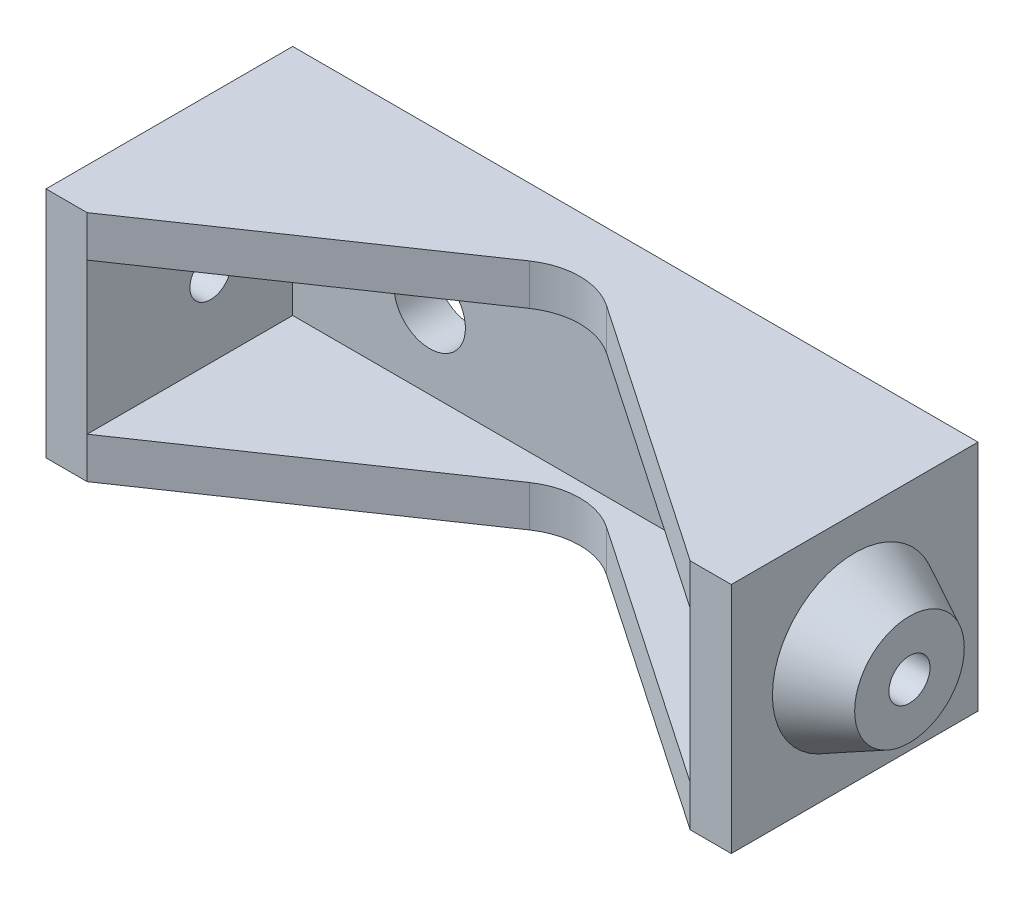
ISO-10303-21;
HEADER;
FILE_DESCRIPTION(('STEP AP214'),'2;1');
FILE_NAME('part.step','',(''),(''),'','','');
FILE_SCHEMA(('AUTOMOTIVE_DESIGN { 1 0 10303 214 1 1 1 1 }'));
ENDSEC;
DATA;
#1=APPLICATION_CONTEXT('core data for automotive mechanical design processes');
#2=APPLICATION_PROTOCOL_DEFINITION('international standard','automotive_design',2000,#1);
#3=PRODUCT_CONTEXT('',#1,'mechanical');
#4=PRODUCT('Part','Part','',(#3));
#5=PRODUCT_RELATED_PRODUCT_CATEGORY('part','',(#4));
#6=PRODUCT_DEFINITION_FORMATION('','',#4);
#7=PRODUCT_DEFINITION_CONTEXT('part definition',#1,'design');
#8=PRODUCT_DEFINITION('design','',#6,#7);
#9=PRODUCT_DEFINITION_SHAPE('','',#8);
#10=(LENGTH_UNIT() NAMED_UNIT(*) SI_UNIT(.MILLI.,.METRE.));
#11=(NAMED_UNIT(*) PLANE_ANGLE_UNIT() SI_UNIT($,.RADIAN.));
#12=(NAMED_UNIT(*) SI_UNIT($,.STERADIAN.) SOLID_ANGLE_UNIT());
#13=UNCERTAINTY_MEASURE_WITH_UNIT(LENGTH_MEASURE(1.E-05),#10,'distance_accuracy_value','');
#14=(GEOMETRIC_REPRESENTATION_CONTEXT(3) GLOBAL_UNCERTAINTY_ASSIGNED_CONTEXT((#13)) GLOBAL_UNIT_ASSIGNED_CONTEXT((#10,
#11,#12)) REPRESENTATION_CONTEXT('',''));
#15=CARTESIAN_POINT('',(0.,0.,0.));
#16=DIRECTION('',(0.,0.,1.));
#17=DIRECTION('',(1.,0.,0.));
#18=AXIS2_PLACEMENT_3D('',#15,#16,#17);
#19=CARTESIAN_POINT('',(0.,0.,18.));
#20=DIRECTION('',(0.,0.,-1.));
#21=DIRECTION('',(-1.,0.,0.));
#22=AXIS2_PLACEMENT_3D('',#19,#20,#21);
#23=PLANE('',#22);
#24=DIRECTION('',(-1.,0.,0.));
#25=VECTOR('',#24,1.);
#26=CARTESIAN_POINT('',(-25.,8.5,18.));
#27=LINE('',#26,#25);
#28=CARTESIAN_POINT('',(25.,8.5,18.));
#29=VERTEX_POINT('',#28);
#30=CARTESIAN_POINT('',(22.,8.50000000000001,18.));
#31=VERTEX_POINT('',#30);
#32=EDGE_CURVE('E89',#29,#31,#27,.T.);
#33=ORIENTED_EDGE('',*,*,#32,.T.);
#34=DIRECTION('',(0.,-1.,0.));
#35=VECTOR('',#34,1.);
#36=CARTESIAN_POINT('',(22.,78.2428311728166,18.));
#37=LINE('',#36,#35);
#38=CARTESIAN_POINT('',(22.,5.50000000000001,18.));
#39=VERTEX_POINT('',#38);
#40=EDGE_CURVE('E165',#31,#39,#37,.T.);
#41=ORIENTED_EDGE('',*,*,#40,.T.);
#42=DIRECTION('',(0.,1.,0.));
#43=VECTOR('',#42,1.);
#44=CARTESIAN_POINT('',(22.,-5.5,18.));
#45=LINE('',#44,#43);
#46=CARTESIAN_POINT('',(22.,-5.50000000000001,18.));
#47=VERTEX_POINT('',#46);
#48=EDGE_CURVE('E191',#47,#39,#45,.T.);
#49=ORIENTED_EDGE('',*,*,#48,.F.);
#50=CARTESIAN_POINT('',(22.,-8.49999999999999,18.));
#51=VERTEX_POINT('',#50);
#52=EDGE_CURVE('E181',#47,#51,#37,.T.);
#53=ORIENTED_EDGE('',*,*,#52,.T.);
#54=DIRECTION('',(1.,0.,0.));
#55=VECTOR('',#54,1.);
#56=CARTESIAN_POINT('',(-25.,-8.5,18.));
#57=LINE('',#56,#55);
#58=CARTESIAN_POINT('',(25.,-8.5,18.));
#59=VERTEX_POINT('',#58);
#60=EDGE_CURVE('E59',#51,#59,#57,.T.);
#61=ORIENTED_EDGE('',*,*,#60,.T.);
#62=DIRECTION('',(0.,1.,0.));
#63=VECTOR('',#62,1.);
#64=CARTESIAN_POINT('',(25.,-8.5,18.));
#65=LINE('',#64,#63);
#66=EDGE_CURVE('E222',#59,#29,#65,.T.);
#67=ORIENTED_EDGE('',*,*,#66,.T.);
#68=EDGE_LOOP('',(#33,#41,#49,#53,#61,#67));
#69=FACE_BOUND('',#68,.T.);
#70=ADVANCED_FACE('F34',(#69),#23,.F.);
#71=CARTESIAN_POINT('',(25.,-8.5,18.));
#72=DIRECTION('',(-1.,0.,0.));
#73=DIRECTION('',(0.,0.,1.));
#74=AXIS2_PLACEMENT_3D('',#71,#72,#73);
#75=PLANE('',#74);
#76=CARTESIAN_POINT('',(25.,0.,9.));
#77=DIRECTION('',(-1.,0.,0.));
#78=DIRECTION('',(0.,0.,1.));
#79=AXIS2_PLACEMENT_3D('',#76,#77,#78);
#80=CIRCLE('',#79,6.00000000000001);
#81=CARTESIAN_POINT('',(25.,0.,15.));
#82=VERTEX_POINT('',#81);
#83=EDGE_CURVE('E43',#82,#82,#80,.T.);
#84=ORIENTED_EDGE('',*,*,#83,.T.);
#85=EDGE_LOOP('',(#84));
#86=FACE_BOUND('',#85,.T.);
#87=DIRECTION('',(0.,1.,0.));
#88=VECTOR('',#87,1.);
#89=CARTESIAN_POINT('',(25.,-8.5,0.));
#90=LINE('',#89,#88);
#91=CARTESIAN_POINT('',(25.,-8.5,0.));
#92=VERTEX_POINT('',#91);
#93=CARTESIAN_POINT('',(25.,8.5,0.));
#94=VERTEX_POINT('',#93);
#95=EDGE_CURVE('E213',#92,#94,#90,.T.);
#96=ORIENTED_EDGE('',*,*,#95,.T.);
#97=DIRECTION('',(0.,0.,-1.));
#98=VECTOR('',#97,1.);
#99=CARTESIAN_POINT('',(25.,8.5,18.));
#100=LINE('',#99,#98);
#101=EDGE_CURVE('E245',#29,#94,#100,.T.);
#102=ORIENTED_EDGE('',*,*,#101,.F.);
#103=ORIENTED_EDGE('',*,*,#66,.F.);
#104=DIRECTION('',(0.,0.,-1.));
#105=VECTOR('',#104,1.);
#106=CARTESIAN_POINT('',(25.,-8.5,18.));
#107=LINE('',#106,#105);
#108=EDGE_CURVE('E231',#59,#92,#107,.T.);
#109=ORIENTED_EDGE('',*,*,#108,.T.);
#110=EDGE_LOOP('',(#96,#102,#103,#109));
#111=FACE_BOUND('',#110,.T.);
#112=ADVANCED_FACE('F256',(#86,#111),#75,.F.);
#113=CARTESIAN_POINT('',(-25.,8.5,18.));
#114=DIRECTION('',(0.,-1.,0.));
#115=DIRECTION('',(0.,0.,-1.));
#116=AXIS2_PLACEMENT_3D('',#113,#114,#115);
#117=PLANE('',#116);
#118=CARTESIAN_POINT('',(0.,8.50000000000001,9.05160316167925));
#119=DIRECTION('',(0.,-1.,0.));
#120=DIRECTION('',(0.,0.,-1.));
#121=AXIS2_PLACEMENT_3D('',#118,#119,#120);
#122=CIRCLE('',#121,5.);
#123=CARTESIAN_POINT('',(2.81668412320757,8.50000000000001,4.92046644764152));
#124=VERTEX_POINT('',#123);
#125=CARTESIAN_POINT('',(-2.81668412320757,8.50000000000001,4.92046644764153));
#126=VERTEX_POINT('',#125);
#127=EDGE_CURVE('E153',#124,#126,#122,.F.);
#128=ORIENTED_EDGE('',*,*,#127,.F.);
#129=DIRECTION('',(-0.826227342807548,0.,-0.56333682464151));
#130=VECTOR('',#129,1.);
#131=CARTESIAN_POINT('',(2.81668412320757,8.50000000000001,4.92046644764152));
#132=LINE('',#131,#130);
#133=EDGE_CURVE('E162',#31,#124,#132,.T.);
#134=ORIENTED_EDGE('',*,*,#133,.F.);
#135=ORIENTED_EDGE('',*,*,#32,.F.);
#136=ORIENTED_EDGE('',*,*,#101,.T.);
#137=DIRECTION('',(-1.,0.,0.));
#138=VECTOR('',#137,1.);
#139=CARTESIAN_POINT('',(-25.,8.5,0.));
#140=LINE('',#139,#138);
#141=CARTESIAN_POINT('',(-25.,8.5,0.));
#142=VERTEX_POINT('',#141);
#143=EDGE_CURVE('E234',#94,#142,#140,.T.);
#144=ORIENTED_EDGE('',*,*,#143,.T.);
#145=DIRECTION('',(0.,0.,-1.));
#146=VECTOR('',#145,1.);
#147=CARTESIAN_POINT('',(-25.,8.5,18.));
#148=LINE('',#147,#146);
#149=CARTESIAN_POINT('',(-25.,8.5,18.));
#150=VERTEX_POINT('',#149);
#151=EDGE_CURVE('E242',#150,#142,#148,.T.);
#152=ORIENTED_EDGE('',*,*,#151,.F.);
#153=CARTESIAN_POINT('',(-22.,8.50000000000001,18.));
#154=VERTEX_POINT('',#153);
#155=EDGE_CURVE('E224',#154,#150,#27,.T.);
#156=ORIENTED_EDGE('',*,*,#155,.F.);
#157=DIRECTION('',(-0.826227342807548,0.,0.56333682464151));
#158=VECTOR('',#157,1.);
#159=CARTESIAN_POINT('',(-2.81668412320757,8.50000000000001,4.92046644764153));
#160=LINE('',#159,#158);
#161=EDGE_CURVE('E170',#126,#154,#160,.T.);
#162=ORIENTED_EDGE('',*,*,#161,.F.);
#163=EDGE_LOOP('',(#128,#134,#135,#136,#144,#152,#156,#162));
#164=FACE_BOUND('',#163,.T.);
#165=ADVANCED_FACE('F168',(#164),#117,.F.);
#166=CARTESIAN_POINT('',(-25.,-8.5,18.));
#167=DIRECTION('',(1.,0.,0.));
#168=DIRECTION('',(0.,0.,-1.));
#169=AXIS2_PLACEMENT_3D('',#166,#167,#168);
#170=PLANE('',#169);
#171=CARTESIAN_POINT('',(-25.,0.,9.));
#172=DIRECTION('',(1.,0.,0.));
#173=DIRECTION('',(0.,0.,-1.));
#174=AXIS2_PLACEMENT_3D('',#171,#172,#173);
#175=CIRCLE('',#174,5.99999999999999);
#176=CARTESIAN_POINT('',(-25.,0.,3.));
#177=VERTEX_POINT('',#176);
#178=EDGE_CURVE('E11',#177,#177,#175,.T.);
#179=ORIENTED_EDGE('',*,*,#178,.T.);
#180=EDGE_LOOP('',(#179));
#181=FACE_BOUND('',#180,.T.);
#182=DIRECTION('',(0.,-1.,0.));
#183=VECTOR('',#182,1.);
#184=CARTESIAN_POINT('',(-25.,-8.5,0.));
#185=LINE('',#184,#183);
#186=CARTESIAN_POINT('',(-25.,-8.5,0.));
#187=VERTEX_POINT('',#186);
#188=EDGE_CURVE('E236',#142,#187,#185,.T.);
#189=ORIENTED_EDGE('',*,*,#188,.T.);
#190=DIRECTION('',(0.,0.,-1.));
#191=VECTOR('',#190,1.);
#192=CARTESIAN_POINT('',(-25.,-8.5,18.));
#193=LINE('',#192,#191);
#194=CARTESIAN_POINT('',(-25.,-8.5,18.));
#195=VERTEX_POINT('',#194);
#196=EDGE_CURVE('E240',#195,#187,#193,.T.);
#197=ORIENTED_EDGE('',*,*,#196,.F.);
#198=DIRECTION('',(0.,-1.,0.));
#199=VECTOR('',#198,1.);
#200=CARTESIAN_POINT('',(-25.,-8.5,18.));
#201=LINE('',#200,#199);
#202=EDGE_CURVE('E226',#150,#195,#201,.T.);
#203=ORIENTED_EDGE('',*,*,#202,.F.);
#204=ORIENTED_EDGE('',*,*,#151,.T.);
#205=EDGE_LOOP('',(#189,#197,#203,#204));
#206=FACE_BOUND('',#205,.T.);
#207=ADVANCED_FACE('F325',(#181,#206),#170,.F.);
#208=CARTESIAN_POINT('',(-25.,-8.5,18.));
#209=DIRECTION('',(0.,1.,0.));
#210=DIRECTION('',(0.,0.,1.));
#211=AXIS2_PLACEMENT_3D('',#208,#209,#210);
#212=PLANE('',#211);
#213=CARTESIAN_POINT('',(0.,-8.49999999999999,9.05160316167925));
#214=DIRECTION('',(0.,-1.,0.));
#215=DIRECTION('',(0.,0.,-1.));
#216=AXIS2_PLACEMENT_3D('',#213,#214,#215);
#217=CIRCLE('',#216,5.);
#218=CARTESIAN_POINT('',(2.81668412320757,-8.49999999999999,4.92046644764152));
#219=VERTEX_POINT('',#218);
#220=CARTESIAN_POINT('',(-2.81668412320757,-8.49999999999999,4.92046644764153));
#221=VERTEX_POINT('',#220);
#222=EDGE_CURVE('E294',#219,#221,#217,.F.);
#223=ORIENTED_EDGE('',*,*,#222,.T.);
#224=DIRECTION('',(-0.826227342807548,0.,0.56333682464151));
#225=VECTOR('',#224,1.);
#226=CARTESIAN_POINT('',(-2.81668412320757,-8.49999999999999,4.92046644764153));
#227=LINE('',#226,#225);
#228=CARTESIAN_POINT('',(-22.,-8.49999999999999,18.));
#229=VERTEX_POINT('',#228);
#230=EDGE_CURVE('E172',#221,#229,#227,.T.);
#231=ORIENTED_EDGE('',*,*,#230,.T.);
#232=EDGE_CURVE('E228',#195,#229,#57,.T.);
#233=ORIENTED_EDGE('',*,*,#232,.F.);
#234=ORIENTED_EDGE('',*,*,#196,.T.);
#235=DIRECTION('',(1.,0.,0.));
#236=VECTOR('',#235,1.);
#237=CARTESIAN_POINT('',(-25.,-8.5,0.));
#238=LINE('',#237,#236);
#239=EDGE_CURVE('E81',#187,#92,#238,.T.);
#240=ORIENTED_EDGE('',*,*,#239,.T.);
#241=ORIENTED_EDGE('',*,*,#108,.F.);
#242=ORIENTED_EDGE('',*,*,#60,.F.);
#243=DIRECTION('',(-0.826227342807548,0.,-0.56333682464151));
#244=VECTOR('',#243,1.);
#245=CARTESIAN_POINT('',(2.81668412320757,-8.49999999999999,4.92046644764152));
#246=LINE('',#245,#244);
#247=EDGE_CURVE('E291',#51,#219,#246,.T.);
#248=ORIENTED_EDGE('',*,*,#247,.T.);
#249=EDGE_LOOP('',(#223,#231,#233,#234,#240,#241,#242,#248));
#250=FACE_BOUND('',#249,.T.);
#251=ADVANCED_FACE('F298',(#250),#212,.F.);
#252=ORIENTED_EDGE('',*,*,#232,.T.);
#253=DIRECTION('',(0.,-1.,0.));
#254=VECTOR('',#253,1.);
#255=CARTESIAN_POINT('',(-22.,78.2428311728166,18.));
#256=LINE('',#255,#254);
#257=CARTESIAN_POINT('',(-22.,-5.50000000000001,18.));
#258=VERTEX_POINT('',#257);
#259=EDGE_CURVE('E178',#258,#229,#256,.T.);
#260=ORIENTED_EDGE('',*,*,#259,.F.);
#261=DIRECTION('',(0.,-1.,0.));
#262=VECTOR('',#261,1.);
#263=CARTESIAN_POINT('',(-22.,-5.5,18.));
#264=LINE('',#263,#262);
#265=CARTESIAN_POINT('',(-22.,5.5,18.));
#266=VERTEX_POINT('',#265);
#267=EDGE_CURVE('E196',#266,#258,#264,.T.);
#268=ORIENTED_EDGE('',*,*,#267,.F.);
#269=EDGE_CURVE('E176',#154,#266,#256,.T.);
#270=ORIENTED_EDGE('',*,*,#269,.F.);
#271=ORIENTED_EDGE('',*,*,#155,.T.);
#272=ORIENTED_EDGE('',*,*,#202,.T.);
#273=EDGE_LOOP('',(#252,#260,#268,#270,#271,#272));
#274=FACE_BOUND('',#273,.T.);
#275=ADVANCED_FACE('F307',(#274),#23,.F.);
#276=CARTESIAN_POINT('',(0.,0.,0.));
#277=DIRECTION('',(0.,0.,-1.));
#278=DIRECTION('',(-1.,0.,0.));
#279=AXIS2_PLACEMENT_3D('',#276,#277,#278);
#280=PLANE('',#279);
#281=CARTESIAN_POINT('',(12.,0.,0.));
#282=DIRECTION('',(0.,0.,1.));
#283=DIRECTION('',(-1.,0.,0.));
#284=AXIS2_PLACEMENT_3D('',#281,#282,#283);
#285=CIRCLE('',#284,2.6);
#286=CARTESIAN_POINT('',(9.39999999999999,0.,0.));
#287=VERTEX_POINT('',#286);
#288=EDGE_CURVE('E281',#287,#287,#285,.T.);
#289=ORIENTED_EDGE('',*,*,#288,.T.);
#290=EDGE_LOOP('',(#289));
#291=FACE_BOUND('',#290,.T.);
#292=CARTESIAN_POINT('',(-12.,0.,0.));
#293=DIRECTION('',(0.,0.,1.));
#294=DIRECTION('',(1.,0.,0.));
#295=AXIS2_PLACEMENT_3D('',#292,#293,#294);
#296=CIRCLE('',#295,2.6);
#297=CARTESIAN_POINT('',(-9.39999999999999,0.,0.));
#298=VERTEX_POINT('',#297);
#299=EDGE_CURVE('E166',#298,#298,#296,.T.);
#300=ORIENTED_EDGE('',*,*,#299,.T.);
#301=EDGE_LOOP('',(#300));
#302=FACE_BOUND('',#301,.T.);
#303=ORIENTED_EDGE('',*,*,#95,.F.);
#304=ORIENTED_EDGE('',*,*,#239,.F.);
#305=ORIENTED_EDGE('',*,*,#188,.F.);
#306=ORIENTED_EDGE('',*,*,#143,.F.);
#307=EDGE_LOOP('',(#303,#304,#305,#306));
#308=FACE_BOUND('',#307,.T.);
#309=ADVANCED_FACE('F328',(#291,#302,#308),#280,.T.);
#310=CARTESIAN_POINT('',(22.,-5.5,3.));
#311=DIRECTION('',(1.,0.,0.));
#312=DIRECTION('',(0.,0.,-1.));
#313=AXIS2_PLACEMENT_3D('',#310,#311,#312);
#314=PLANE('',#313);
#315=CARTESIAN_POINT('',(22.,0.,9.));
#316=DIRECTION('',(1.,0.,0.));
#317=DIRECTION('',(0.,0.,-1.));
#318=AXIS2_PLACEMENT_3D('',#315,#316,#317);
#319=CIRCLE('',#318,1.5);
#320=CARTESIAN_POINT('',(22.,0.,7.5));
#321=VERTEX_POINT('',#320);
#322=EDGE_CURVE('E274',#321,#321,#319,.T.);
#323=ORIENTED_EDGE('',*,*,#322,.T.);
#324=EDGE_LOOP('',(#323));
#325=FACE_BOUND('',#324,.T.);
#326=ORIENTED_EDGE('',*,*,#48,.T.);
#327=DIRECTION('',(0.,0.,1.));
#328=VECTOR('',#327,1.);
#329=CARTESIAN_POINT('',(22.,5.5,3.));
#330=LINE('',#329,#328);
#331=CARTESIAN_POINT('',(22.,5.5,3.));
#332=VERTEX_POINT('',#331);
#333=EDGE_CURVE('E205',#332,#39,#330,.T.);
#334=ORIENTED_EDGE('',*,*,#333,.F.);
#335=DIRECTION('',(0.,1.,0.));
#336=VECTOR('',#335,1.);
#337=CARTESIAN_POINT('',(22.,-5.5,3.));
#338=LINE('',#337,#336);
#339=CARTESIAN_POINT('',(22.,-5.5,3.));
#340=VERTEX_POINT('',#339);
#341=EDGE_CURVE('E192',#340,#332,#338,.T.);
#342=ORIENTED_EDGE('',*,*,#341,.F.);
#343=DIRECTION('',(0.,0.,1.));
#344=VECTOR('',#343,1.);
#345=CARTESIAN_POINT('',(22.,-5.5,3.));
#346=LINE('',#345,#344);
#347=EDGE_CURVE('E210',#340,#47,#346,.T.);
#348=ORIENTED_EDGE('',*,*,#347,.T.);
#349=EDGE_LOOP('',(#326,#334,#342,#348));
#350=FACE_BOUND('',#349,.T.);
#351=ADVANCED_FACE('F333',(#325,#350),#314,.F.);
#352=CARTESIAN_POINT('',(-22.,-5.5,3.));
#353=DIRECTION('',(0.,-1.,0.));
#354=DIRECTION('',(0.,0.,-1.));
#355=AXIS2_PLACEMENT_3D('',#352,#353,#354);
#356=PLANE('',#355);
#357=CARTESIAN_POINT('',(0.,-5.50000000000001,9.05160316167925));
#358=DIRECTION('',(0.,-1.,0.));
#359=DIRECTION('',(0.,0.,-1.));
#360=AXIS2_PLACEMENT_3D('',#357,#358,#359);
#361=CIRCLE('',#360,5.);
#362=CARTESIAN_POINT('',(-2.81668412320757,-5.5,4.92046644764153));
#363=VERTEX_POINT('',#362);
#364=CARTESIAN_POINT('',(2.81668412320757,-5.50000000000001,4.92046644764152));
#365=VERTEX_POINT('',#364);
#366=EDGE_CURVE('E185',#363,#365,#361,.T.);
#367=ORIENTED_EDGE('',*,*,#366,.T.);
#368=DIRECTION('',(0.826227342807548,0.,0.56333682464151));
#369=VECTOR('',#368,1.);
#370=CARTESIAN_POINT('',(-15.0183356840621,-5.5,-7.23977433004231));
#371=LINE('',#370,#369);
#372=EDGE_CURVE('E188',#365,#47,#371,.T.);
#373=ORIENTED_EDGE('',*,*,#372,.T.);
#374=ORIENTED_EDGE('',*,*,#347,.F.);
#375=DIRECTION('',(1.,0.,0.));
#376=VECTOR('',#375,1.);
#377=CARTESIAN_POINT('',(-22.,-5.5,3.));
#378=LINE('',#377,#376);
#379=CARTESIAN_POINT('',(-22.,-5.5,3.));
#380=VERTEX_POINT('',#379);
#381=EDGE_CURVE('E202',#380,#340,#378,.T.);
#382=ORIENTED_EDGE('',*,*,#381,.F.);
#383=DIRECTION('',(0.,0.,1.));
#384=VECTOR('',#383,1.);
#385=CARTESIAN_POINT('',(-22.,-5.5,3.));
#386=LINE('',#385,#384);
#387=EDGE_CURVE('E214',#380,#258,#386,.T.);
#388=ORIENTED_EDGE('',*,*,#387,.T.);
#389=DIRECTION('',(0.826227342807548,0.,-0.56333682464151));
#390=VECTOR('',#389,1.);
#391=CARTESIAN_POINT('',(-15.0183356840621,-5.5,13.2397743300423));
#392=LINE('',#391,#390);
#393=EDGE_CURVE('E159',#258,#363,#392,.T.);
#394=ORIENTED_EDGE('',*,*,#393,.T.);
#395=EDGE_LOOP('',(#367,#373,#374,#382,#388,#394));
#396=FACE_BOUND('',#395,.T.);
#397=ADVANCED_FACE('F311',(#396),#356,.F.);
#398=CARTESIAN_POINT('',(-22.,-5.5,3.));
#399=DIRECTION('',(-1.,0.,0.));
#400=DIRECTION('',(0.,0.,1.));
#401=AXIS2_PLACEMENT_3D('',#398,#399,#400);
#402=PLANE('',#401);
#403=CARTESIAN_POINT('',(-22.,0.,9.));
#404=DIRECTION('',(-1.,0.,0.));
#405=DIRECTION('',(0.,0.,1.));
#406=AXIS2_PLACEMENT_3D('',#403,#404,#405);
#407=CIRCLE('',#406,1.5);
#408=CARTESIAN_POINT('',(-22.,0.,10.5));
#409=VERTEX_POINT('',#408);
#410=EDGE_CURVE('E38',#409,#409,#407,.T.);
#411=ORIENTED_EDGE('',*,*,#410,.T.);
#412=EDGE_LOOP('',(#411));
#413=FACE_BOUND('',#412,.T.);
#414=ORIENTED_EDGE('',*,*,#267,.T.);
#415=ORIENTED_EDGE('',*,*,#387,.F.);
#416=DIRECTION('',(0.,-1.,0.));
#417=VECTOR('',#416,1.);
#418=CARTESIAN_POINT('',(-22.,-5.5,3.));
#419=LINE('',#418,#417);
#420=CARTESIAN_POINT('',(-22.,5.5,3.));
#421=VERTEX_POINT('',#420);
#422=EDGE_CURVE('E199',#421,#380,#419,.T.);
#423=ORIENTED_EDGE('',*,*,#422,.F.);
#424=DIRECTION('',(0.,0.,1.));
#425=VECTOR('',#424,1.);
#426=CARTESIAN_POINT('',(-22.,5.5,3.));
#427=LINE('',#426,#425);
#428=EDGE_CURVE('E217',#421,#266,#427,.T.);
#429=ORIENTED_EDGE('',*,*,#428,.T.);
#430=EDGE_LOOP('',(#414,#415,#423,#429));
#431=FACE_BOUND('',#430,.T.);
#432=ADVANCED_FACE('F314',(#413,#431),#402,.F.);
#433=CARTESIAN_POINT('',(-22.,5.5,3.));
#434=DIRECTION('',(0.,1.,0.));
#435=DIRECTION('',(0.,0.,1.));
#436=AXIS2_PLACEMENT_3D('',#433,#434,#435);
#437=PLANE('',#436);
#438=ORIENTED_EDGE('',*,*,#333,.T.);
#439=DIRECTION('',(-0.826227342807548,0.,-0.56333682464151));
#440=VECTOR('',#439,1.);
#441=CARTESIAN_POINT('',(-15.0183356840621,5.5,-7.23977433004231));
#442=LINE('',#441,#440);
#443=CARTESIAN_POINT('',(2.81668412320757,5.50000000000001,4.92046644764152));
#444=VERTEX_POINT('',#443);
#445=EDGE_CURVE('E251',#39,#444,#442,.T.);
#446=ORIENTED_EDGE('',*,*,#445,.T.);
#447=CARTESIAN_POINT('',(0.,5.50000000000001,9.05160316167925));
#448=DIRECTION('',(0.,1.,0.));
#449=DIRECTION('',(0.,0.,1.));
#450=AXIS2_PLACEMENT_3D('',#447,#448,#449);
#451=CIRCLE('',#450,5.);
#452=CARTESIAN_POINT('',(-2.81668412320757,5.50000000000001,4.92046644764153));
#453=VERTEX_POINT('',#452);
#454=EDGE_CURVE('E156',#444,#453,#451,.T.);
#455=ORIENTED_EDGE('',*,*,#454,.T.);
#456=DIRECTION('',(-0.826227342807548,0.,0.56333682464151));
#457=VECTOR('',#456,1.);
#458=CARTESIAN_POINT('',(-15.0183356840621,5.5,13.2397743300423));
#459=LINE('',#458,#457);
#460=EDGE_CURVE('E247',#453,#266,#459,.T.);
#461=ORIENTED_EDGE('',*,*,#460,.T.);
#462=ORIENTED_EDGE('',*,*,#428,.F.);
#463=DIRECTION('',(-1.,0.,0.));
#464=VECTOR('',#463,1.);
#465=CARTESIAN_POINT('',(-22.,5.5,3.));
#466=LINE('',#465,#464);
#467=EDGE_CURVE('E195',#332,#421,#466,.T.);
#468=ORIENTED_EDGE('',*,*,#467,.F.);
#469=EDGE_LOOP('',(#438,#446,#455,#461,#462,#468));
#470=FACE_BOUND('',#469,.T.);
#471=ADVANCED_FACE('F317',(#470),#437,.F.);
#472=CARTESIAN_POINT('',(0.,0.,3.));
#473=DIRECTION('',(0.,0.,-1.));
#474=DIRECTION('',(-1.,0.,0.));
#475=AXIS2_PLACEMENT_3D('',#472,#473,#474);
#476=PLANE('',#475);
#477=CARTESIAN_POINT('',(12.,0.,3.));
#478=DIRECTION('',(0.,0.,1.));
#479=DIRECTION('',(-1.,0.,0.));
#480=AXIS2_PLACEMENT_3D('',#477,#478,#479);
#481=CIRCLE('',#480,2.6);
#482=CARTESIAN_POINT('',(9.39999999999999,0.,3.));
#483=VERTEX_POINT('',#482);
#484=EDGE_CURVE('E280',#483,#483,#481,.T.);
#485=ORIENTED_EDGE('',*,*,#484,.F.);
#486=EDGE_LOOP('',(#485));
#487=FACE_BOUND('',#486,.T.);
#488=CARTESIAN_POINT('',(-12.,0.,3.));
#489=DIRECTION('',(0.,0.,1.));
#490=DIRECTION('',(1.,0.,0.));
#491=AXIS2_PLACEMENT_3D('',#488,#489,#490);
#492=CIRCLE('',#491,2.6);
#493=CARTESIAN_POINT('',(-9.39999999999999,0.,3.));
#494=VERTEX_POINT('',#493);
#495=EDGE_CURVE('E284',#494,#494,#492,.T.);
#496=ORIENTED_EDGE('',*,*,#495,.F.);
#497=EDGE_LOOP('',(#496));
#498=FACE_BOUND('',#497,.T.);
#499=ORIENTED_EDGE('',*,*,#341,.T.);
#500=ORIENTED_EDGE('',*,*,#467,.T.);
#501=ORIENTED_EDGE('',*,*,#422,.T.);
#502=ORIENTED_EDGE('',*,*,#381,.T.);
#503=EDGE_LOOP('',(#499,#500,#501,#502));
#504=FACE_BOUND('',#503,.T.);
#505=ADVANCED_FACE('F481',(#487,#498,#504),#476,.F.);
#506=CARTESIAN_POINT('',(-2.81668412320757,78.2428311728166,4.92046644764153));
#507=DIRECTION('',(-0.56333682464151,0.,-0.826227342807548));
#508=DIRECTION('',(-0.826227342807548,0.,0.56333682464151));
#509=AXIS2_PLACEMENT_3D('',#506,#507,#508);
#510=PLANE('',#509);
#511=ORIENTED_EDGE('',*,*,#460,.F.);
#512=DIRECTION('',(0.,-1.,0.));
#513=VECTOR('',#512,1.);
#514=CARTESIAN_POINT('',(-2.81668412320757,78.2428311728166,4.92046644764153));
#515=LINE('',#514,#513);
#516=EDGE_CURVE('E179',#126,#453,#515,.T.);
#517=ORIENTED_EDGE('',*,*,#516,.F.);
#518=ORIENTED_EDGE('',*,*,#161,.T.);
#519=ORIENTED_EDGE('',*,*,#269,.T.);
#520=EDGE_LOOP('',(#511,#517,#518,#519));
#521=FACE_BOUND('',#520,.T.);
#522=ADVANCED_FACE('F319',(#521),#510,.F.);
#523=CARTESIAN_POINT('',(0.,78.2428311728166,9.05160316167925));
#524=DIRECTION('',(0.,-1.,0.));
#525=DIRECTION('',(0.,0.,-1.));
#526=AXIS2_PLACEMENT_3D('',#523,#524,#525);
#527=CYLINDRICAL_SURFACE('',#526,5.);
#528=ORIENTED_EDGE('',*,*,#454,.F.);
#529=DIRECTION('',(0.,-1.,0.));
#530=VECTOR('',#529,1.);
#531=CARTESIAN_POINT('',(2.81668412320757,78.2428311728166,4.92046644764152));
#532=LINE('',#531,#530);
#533=EDGE_CURVE('E148',#124,#444,#532,.T.);
#534=ORIENTED_EDGE('',*,*,#533,.F.);
#535=ORIENTED_EDGE('',*,*,#127,.T.);
#536=ORIENTED_EDGE('',*,*,#516,.T.);
#537=EDGE_LOOP('',(#528,#534,#535,#536));
#538=FACE_BOUND('',#537,.T.);
#539=ADVANCED_FACE('F150',(#538),#527,.F.);
#540=CARTESIAN_POINT('',(2.81668412320757,78.2428311728166,4.92046644764152));
#541=DIRECTION('',(0.56333682464151,0.,-0.826227342807548));
#542=DIRECTION('',(-0.826227342807548,0.,-0.56333682464151));
#543=AXIS2_PLACEMENT_3D('',#540,#541,#542);
#544=PLANE('',#543);
#545=ORIENTED_EDGE('',*,*,#445,.F.);
#546=ORIENTED_EDGE('',*,*,#40,.F.);
#547=ORIENTED_EDGE('',*,*,#133,.T.);
#548=ORIENTED_EDGE('',*,*,#533,.T.);
#549=EDGE_LOOP('',(#545,#546,#547,#548));
#550=FACE_BOUND('',#549,.T.);
#551=ADVANCED_FACE('F163',(#550),#544,.F.);
#552=ORIENTED_EDGE('',*,*,#372,.F.);
#553=EDGE_CURVE('E160',#365,#219,#532,.T.);
#554=ORIENTED_EDGE('',*,*,#553,.T.);
#555=ORIENTED_EDGE('',*,*,#247,.F.);
#556=ORIENTED_EDGE('',*,*,#52,.F.);
#557=EDGE_LOOP('',(#552,#554,#555,#556));
#558=FACE_BOUND('',#557,.T.);
#559=ADVANCED_FACE('F336',(#558),#544,.F.);
#560=ORIENTED_EDGE('',*,*,#366,.F.);
#561=EDGE_CURVE('E50',#363,#221,#515,.T.);
#562=ORIENTED_EDGE('',*,*,#561,.T.);
#563=ORIENTED_EDGE('',*,*,#222,.F.);
#564=ORIENTED_EDGE('',*,*,#553,.F.);
#565=EDGE_LOOP('',(#560,#562,#563,#564));
#566=FACE_BOUND('',#565,.T.);
#567=ADVANCED_FACE('F302',(#566),#527,.F.);
#568=ORIENTED_EDGE('',*,*,#393,.F.);
#569=ORIENTED_EDGE('',*,*,#259,.T.);
#570=ORIENTED_EDGE('',*,*,#230,.F.);
#571=ORIENTED_EDGE('',*,*,#561,.F.);
#572=EDGE_LOOP('',(#568,#569,#570,#571));
#573=FACE_BOUND('',#572,.T.);
#574=ADVANCED_FACE('F303',(#573),#510,.F.);
#575=CARTESIAN_POINT('',(-12.,0.,0.));
#576=DIRECTION('',(0.,0.,1.));
#577=DIRECTION('',(1.,0.,0.));
#578=AXIS2_PLACEMENT_3D('',#575,#576,#577);
#579=CYLINDRICAL_SURFACE('',#578,2.6);
#580=ORIENTED_EDGE('',*,*,#299,.F.);
#581=EDGE_LOOP('',(#580));
#582=FACE_BOUND('',#581,.T.);
#583=ORIENTED_EDGE('',*,*,#495,.T.);
#584=EDGE_LOOP('',(#583));
#585=FACE_BOUND('',#584,.T.);
#586=ADVANCED_FACE('F464',(#582,#585),#579,.F.);
#587=CARTESIAN_POINT('',(12.,0.,0.));
#588=DIRECTION('',(0.,0.,1.));
#589=DIRECTION('',(1.,0.,0.));
#590=AXIS2_PLACEMENT_3D('',#587,#588,#589);
#591=CYLINDRICAL_SURFACE('',#590,2.6);
#592=ORIENTED_EDGE('',*,*,#288,.F.);
#593=EDGE_LOOP('',(#592));
#594=FACE_BOUND('',#593,.T.);
#595=ORIENTED_EDGE('',*,*,#484,.T.);
#596=EDGE_LOOP('',(#595));
#597=FACE_BOUND('',#596,.T.);
#598=ADVANCED_FACE('F454',(#594,#597),#591,.F.);
#599=CARTESIAN_POINT('',(-29.,0.,9.));
#600=DIRECTION('',(-1.,0.,0.));
#601=DIRECTION('',(0.,0.,1.));
#602=AXIS2_PLACEMENT_3D('',#599,#600,#601);
#603=PLANE('',#602);
#604=CARTESIAN_POINT('',(-29.,0.,9.));
#605=DIRECTION('',(-1.,0.,0.));
#606=DIRECTION('',(0.,0.,1.));
#607=AXIS2_PLACEMENT_3D('',#604,#605,#606);
#608=CIRCLE('',#607,4.);
#609=CARTESIAN_POINT('',(-29.,0.,13.));
#610=VERTEX_POINT('',#609);
#611=EDGE_CURVE('E271',#610,#610,#608,.T.);
#612=ORIENTED_EDGE('',*,*,#611,.T.);
#613=EDGE_LOOP('',(#612));
#614=FACE_BOUND('',#613,.T.);
#615=CARTESIAN_POINT('',(-29.,0.,9.));
#616=DIRECTION('',(-1.,0.,0.));
#617=DIRECTION('',(0.,0.,1.));
#618=AXIS2_PLACEMENT_3D('',#615,#616,#617);
#619=CIRCLE('',#618,1.5);
#620=CARTESIAN_POINT('',(-29.,0.,10.5));
#621=VERTEX_POINT('',#620);
#622=EDGE_CURVE('E267',#621,#621,#619,.T.);
#623=ORIENTED_EDGE('',*,*,#622,.F.);
#624=EDGE_LOOP('',(#623));
#625=FACE_BOUND('',#624,.T.);
#626=ADVANCED_FACE('F428',(#614,#625),#603,.T.);
#627=CARTESIAN_POINT('',(-29.,0.,9.));
#628=DIRECTION('',(1.,0.,0.));
#629=DIRECTION('',(0.,0.,-1.));
#630=AXIS2_PLACEMENT_3D('',#627,#628,#629);
#631=CYLINDRICAL_SURFACE('',#630,1.5);
#632=ORIENTED_EDGE('',*,*,#622,.T.);
#633=EDGE_LOOP('',(#632));
#634=FACE_BOUND('',#633,.T.);
#635=ORIENTED_EDGE('',*,*,#410,.F.);
#636=EDGE_LOOP('',(#635));
#637=FACE_BOUND('',#636,.T.);
#638=ADVANCED_FACE('F423',(#634,#637),#631,.F.);
#639=CARTESIAN_POINT('',(29.,0.,9.));
#640=DIRECTION('',(1.,0.,0.));
#641=DIRECTION('',(0.,0.,-1.));
#642=AXIS2_PLACEMENT_3D('',#639,#640,#641);
#643=PLANE('',#642);
#644=CARTESIAN_POINT('',(29.,0.,9.));
#645=DIRECTION('',(1.,0.,0.));
#646=DIRECTION('',(0.,0.,-1.));
#647=AXIS2_PLACEMENT_3D('',#644,#645,#646);
#648=CIRCLE('',#647,4.);
#649=CARTESIAN_POINT('',(29.,0.,5.));
#650=VERTEX_POINT('',#649);
#651=EDGE_CURVE('E265',#650,#650,#648,.T.);
#652=ORIENTED_EDGE('',*,*,#651,.T.);
#653=EDGE_LOOP('',(#652));
#654=FACE_BOUND('',#653,.T.);
#655=CARTESIAN_POINT('',(29.,0.,9.));
#656=DIRECTION('',(1.,0.,0.));
#657=DIRECTION('',(0.,0.,-1.));
#658=AXIS2_PLACEMENT_3D('',#655,#656,#657);
#659=CIRCLE('',#658,1.5);
#660=CARTESIAN_POINT('',(29.,0.,7.5));
#661=VERTEX_POINT('',#660);
#662=EDGE_CURVE('E268',#661,#661,#659,.T.);
#663=ORIENTED_EDGE('',*,*,#662,.F.);
#664=EDGE_LOOP('',(#663));
#665=FACE_BOUND('',#664,.T.);
#666=ADVANCED_FACE('F427',(#654,#665),#643,.T.);
#667=CARTESIAN_POINT('',(29.,0.,9.));
#668=DIRECTION('',(-1.,0.,0.));
#669=DIRECTION('',(0.,0.,1.));
#670=AXIS2_PLACEMENT_3D('',#667,#668,#669);
#671=CYLINDRICAL_SURFACE('',#670,1.5);
#672=ORIENTED_EDGE('',*,*,#662,.T.);
#673=EDGE_LOOP('',(#672));
#674=FACE_BOUND('',#673,.T.);
#675=ORIENTED_EDGE('',*,*,#322,.F.);
#676=EDGE_LOOP('',(#675));
#677=FACE_BOUND('',#676,.T.);
#678=ADVANCED_FACE('F262',(#674,#677),#671,.F.);
#679=CARTESIAN_POINT('',(29.,0.,9.));
#680=DIRECTION('',(-1.,0.,0.));
#681=DIRECTION('',(0.,0.,1.));
#682=AXIS2_PLACEMENT_3D('',#679,#680,#681);
#683=CONICAL_SURFACE('',#682,4.,0.463647609000807);
#684=ORIENTED_EDGE('',*,*,#83,.F.);
#685=EDGE_LOOP('',(#684));
#686=FACE_BOUND('',#685,.T.);
#687=ORIENTED_EDGE('',*,*,#651,.F.);
#688=EDGE_LOOP('',(#687));
#689=FACE_BOUND('',#688,.T.);
#690=ADVANCED_FACE('F259',(#686,#689),#683,.T.);
#691=CARTESIAN_POINT('',(-29.,0.,9.));
#692=DIRECTION('',(1.,0.,0.));
#693=DIRECTION('',(0.,0.,-1.));
#694=AXIS2_PLACEMENT_3D('',#691,#692,#693);
#695=CONICAL_SURFACE('',#694,4.,0.463647609000808);
#696=ORIENTED_EDGE('',*,*,#178,.F.);
#697=EDGE_LOOP('',(#696));
#698=FACE_BOUND('',#697,.T.);
#699=ORIENTED_EDGE('',*,*,#611,.F.);
#700=EDGE_LOOP('',(#699));
#701=FACE_BOUND('',#700,.T.);
#702=ADVANCED_FACE('F36',(#698,#701),#695,.T.);
#703=CLOSED_SHELL('',(#70,#112,#165,#207,#251,#275,#309,#351,#397,#432,#471,#505,#522,#539,#551,
#559,#567,#574,#586,#598,#626,#638,#666,#678,#690,#702));
#704=MANIFOLD_SOLID_BREP('B2',#703);
#705=ADVANCED_BREP_SHAPE_REPRESENTATION('',(#18,#704),#14);
#706=SHAPE_DEFINITION_REPRESENTATION(#9,#705);
ENDSEC;
END-ISO-10303-21;
